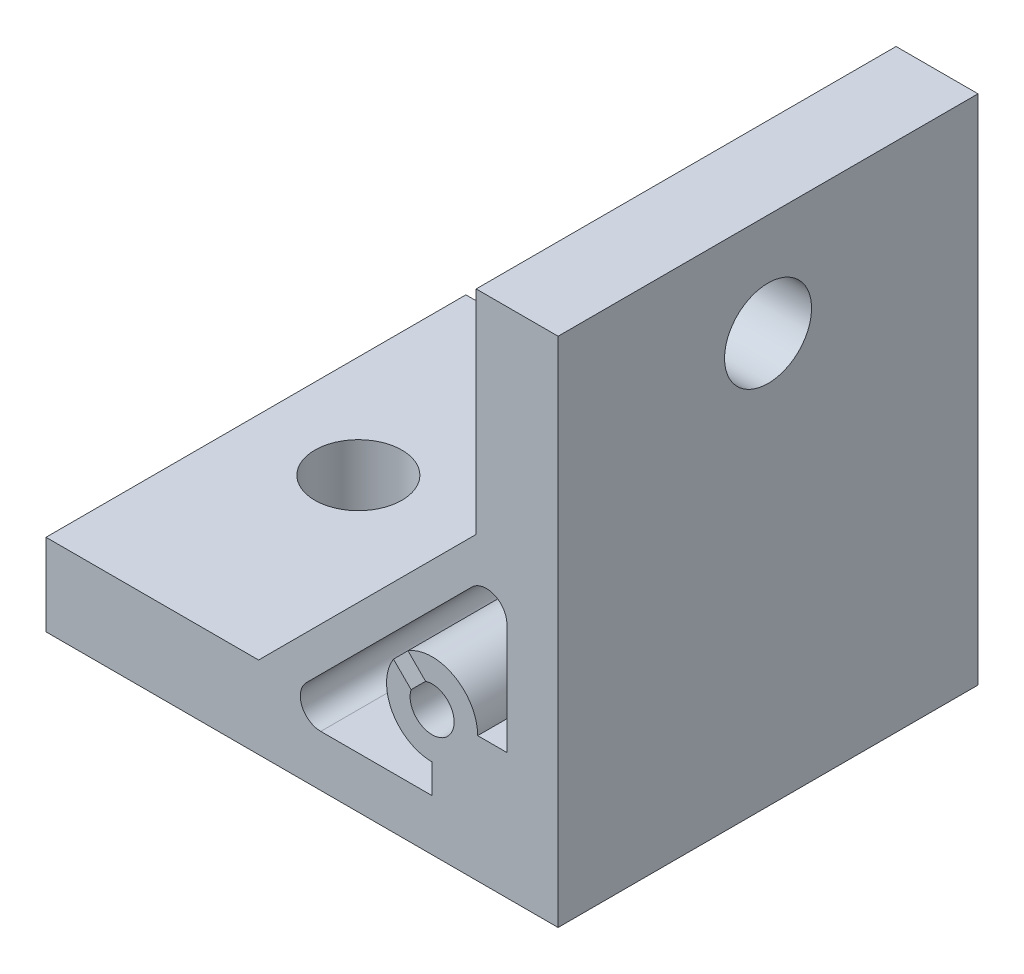
ISO-10303-21;
HEADER;
FILE_DESCRIPTION(('STEP AP214'),'2;1');
FILE_NAME('part.step','',(''),(''),'','','');
FILE_SCHEMA(('AUTOMOTIVE_DESIGN { 1 0 10303 214 1 1 1 1 }'));
ENDSEC;
DATA;
#1=APPLICATION_CONTEXT('core data for automotive mechanical design processes');
#2=APPLICATION_PROTOCOL_DEFINITION('international standard','automotive_design',2000,#1);
#3=PRODUCT_CONTEXT('',#1,'mechanical');
#4=PRODUCT('Part','Part','',(#3));
#5=PRODUCT_RELATED_PRODUCT_CATEGORY('part','',(#4));
#6=PRODUCT_DEFINITION_FORMATION('','',#4);
#7=PRODUCT_DEFINITION_CONTEXT('part definition',#1,'design');
#8=PRODUCT_DEFINITION('design','',#6,#7);
#9=PRODUCT_DEFINITION_SHAPE('','',#8);
#10=(LENGTH_UNIT() NAMED_UNIT(*) SI_UNIT(.MILLI.,.METRE.));
#11=(NAMED_UNIT(*) PLANE_ANGLE_UNIT() SI_UNIT($,.RADIAN.));
#12=(NAMED_UNIT(*) SI_UNIT($,.STERADIAN.) SOLID_ANGLE_UNIT());
#13=UNCERTAINTY_MEASURE_WITH_UNIT(LENGTH_MEASURE(1.E-05),#10,'distance_accuracy_value','');
#14=(GEOMETRIC_REPRESENTATION_CONTEXT(3) GLOBAL_UNCERTAINTY_ASSIGNED_CONTEXT((#13)) GLOBAL_UNIT_ASSIGNED_CONTEXT((#10,
#11,#12)) REPRESENTATION_CONTEXT('',''));
#15=CARTESIAN_POINT('',(0.,0.,0.));
#16=DIRECTION('',(0.,0.,1.));
#17=DIRECTION('',(1.,0.,0.));
#18=AXIS2_PLACEMENT_3D('',#15,#16,#17);
#19=CARTESIAN_POINT('',(50.,0.,20.5));
#20=DIRECTION('',(-1.,0.,0.));
#21=DIRECTION('',(0.,0.,1.));
#22=AXIS2_PLACEMENT_3D('',#19,#20,#21);
#23=PLANE('',#22);
#24=DIRECTION('',(0.,1.,0.));
#25=VECTOR('',#24,1.);
#26=CARTESIAN_POINT('',(50.,0.,-20.5));
#27=LINE('',#26,#25);
#28=CARTESIAN_POINT('',(50.,0.,-20.5));
#29=VERTEX_POINT('',#28);
#30=CARTESIAN_POINT('',(50.,50.,-20.5));
#31=VERTEX_POINT('',#30);
#32=EDGE_CURVE('E283',#29,#31,#27,.T.);
#33=ORIENTED_EDGE('',*,*,#32,.T.);
#34=DIRECTION('',(0.,0.,-1.));
#35=VECTOR('',#34,1.);
#36=CARTESIAN_POINT('',(50.,50.,20.5));
#37=LINE('',#36,#35);
#38=CARTESIAN_POINT('',(50.,50.,20.5));
#39=VERTEX_POINT('',#38);
#40=EDGE_CURVE('E303',#39,#31,#37,.T.);
#41=ORIENTED_EDGE('',*,*,#40,.F.);
#42=DIRECTION('',(0.,1.,0.));
#43=VECTOR('',#42,1.);
#44=CARTESIAN_POINT('',(50.,0.,20.5));
#45=LINE('',#44,#43);
#46=CARTESIAN_POINT('',(50.,0.,20.5));
#47=VERTEX_POINT('',#46);
#48=EDGE_CURVE('E268',#47,#39,#45,.T.);
#49=ORIENTED_EDGE('',*,*,#48,.F.);
#50=DIRECTION('',(0.,0.,-1.));
#51=VECTOR('',#50,1.);
#52=CARTESIAN_POINT('',(50.,0.,20.5));
#53=LINE('',#52,#51);
#54=EDGE_CURVE('E43',#47,#29,#53,.T.);
#55=ORIENTED_EDGE('',*,*,#54,.T.);
#56=EDGE_LOOP('',(#33,#41,#49,#55));
#57=FACE_BOUND('',#56,.T.);
#58=CARTESIAN_POINT('',(50.0000000000001,40.,0.));
#59=DIRECTION('',(1.,0.,0.));
#60=DIRECTION('',(0.,0.,1.));
#61=AXIS2_PLACEMENT_3D('',#58,#59,#60);
#62=CIRCLE('',#61,4.25);
#63=CARTESIAN_POINT('',(50.0000000000001,40.,4.25));
#64=VERTEX_POINT('',#63);
#65=EDGE_CURVE('E369',#64,#64,#62,.T.);
#66=ORIENTED_EDGE('',*,*,#65,.F.);
#67=EDGE_LOOP('',(#66));
#68=FACE_BOUND('',#67,.T.);
#69=ADVANCED_FACE('F35',(#57,#68),#23,.F.);
#70=CARTESIAN_POINT('',(42.,29.2426406871192,20.5));
#71=DIRECTION('',(1.,0.,0.));
#72=DIRECTION('',(0.,0.,-1.));
#73=AXIS2_PLACEMENT_3D('',#70,#71,#72);
#74=PLANE('',#73);
#75=DIRECTION('',(0.,-1.,0.));
#76=VECTOR('',#75,1.);
#77=CARTESIAN_POINT('',(42.,29.2426406871192,-20.5));
#78=LINE('',#77,#76);
#79=CARTESIAN_POINT('',(42.,50.,-20.5));
#80=VERTEX_POINT('',#79);
#81=CARTESIAN_POINT('',(42.,29.2426406871192,-20.5));
#82=VERTEX_POINT('',#81);
#83=EDGE_CURVE('E287',#80,#82,#78,.T.);
#84=ORIENTED_EDGE('',*,*,#83,.T.);
#85=DIRECTION('',(0.,0.,-1.));
#86=VECTOR('',#85,1.);
#87=CARTESIAN_POINT('',(42.,29.2426406871192,20.5));
#88=LINE('',#87,#86);
#89=CARTESIAN_POINT('',(42.,29.2426406871192,20.5));
#90=VERTEX_POINT('',#89);
#91=EDGE_CURVE('E297',#90,#82,#88,.T.);
#92=ORIENTED_EDGE('',*,*,#91,.F.);
#93=DIRECTION('',(0.,-1.,0.));
#94=VECTOR('',#93,1.);
#95=CARTESIAN_POINT('',(42.,29.2426406871192,20.5));
#96=LINE('',#95,#94);
#97=CARTESIAN_POINT('',(42.,50.,20.5));
#98=VERTEX_POINT('',#97);
#99=EDGE_CURVE('E272',#98,#90,#96,.T.);
#100=ORIENTED_EDGE('',*,*,#99,.F.);
#101=DIRECTION('',(0.,0.,-1.));
#102=VECTOR('',#101,1.);
#103=CARTESIAN_POINT('',(42.,50.,20.5));
#104=LINE('',#103,#102);
#105=EDGE_CURVE('E300',#98,#80,#104,.T.);
#106=ORIENTED_EDGE('',*,*,#105,.T.);
#107=EDGE_LOOP('',(#84,#92,#100,#106));
#108=FACE_BOUND('',#107,.T.);
#109=CARTESIAN_POINT('',(42.0000000000001,40.0000000000001,0.));
#110=DIRECTION('',(1.,0.,0.));
#111=DIRECTION('',(0.,0.,1.));
#112=AXIS2_PLACEMENT_3D('',#109,#110,#111);
#113=CIRCLE('',#112,4.25);
#114=CARTESIAN_POINT('',(42.0000000000001,40.0000000000001,4.25));
#115=VERTEX_POINT('',#114);
#116=EDGE_CURVE('E371',#115,#115,#113,.T.);
#117=ORIENTED_EDGE('',*,*,#116,.T.);
#118=EDGE_LOOP('',(#117));
#119=FACE_BOUND('',#118,.T.);
#120=ADVANCED_FACE('F326',(#108,#119),#74,.F.);
#121=CARTESIAN_POINT('',(0.,0.,20.5));
#122=DIRECTION('',(0.,0.,1.));
#123=DIRECTION('',(1.,0.,0.));
#124=AXIS2_PLACEMENT_3D('',#121,#122,#123);
#125=PLANE('',#124);
#126=DIRECTION('',(0.,-1.,0.));
#127=VECTOR('',#126,1.);
#128=CARTESIAN_POINT('',(0.,8.,20.5));
#129=LINE('',#128,#127);
#130=CARTESIAN_POINT('',(0.,8.,20.5));
#131=VERTEX_POINT('',#130);
#132=CARTESIAN_POINT('',(0.,0.,20.5));
#133=VERTEX_POINT('',#132);
#134=EDGE_CURVE('E262',#131,#133,#129,.T.);
#135=ORIENTED_EDGE('',*,*,#134,.T.);
#136=DIRECTION('',(1.,0.,0.));
#137=VECTOR('',#136,1.);
#138=CARTESIAN_POINT('',(0.,0.,20.5));
#139=LINE('',#138,#137);
#140=EDGE_CURVE('E265',#133,#47,#139,.T.);
#141=ORIENTED_EDGE('',*,*,#140,.T.);
#142=ORIENTED_EDGE('',*,*,#48,.T.);
#143=DIRECTION('',(-1.,0.,0.));
#144=VECTOR('',#143,1.);
#145=CARTESIAN_POINT('',(42.,50.,20.5));
#146=LINE('',#145,#144);
#147=EDGE_CURVE('E270',#39,#98,#146,.T.);
#148=ORIENTED_EDGE('',*,*,#147,.T.);
#149=ORIENTED_EDGE('',*,*,#99,.T.);
#150=DIRECTION('',(-0.707106781186546,-0.707106781186549,0.));
#151=VECTOR('',#150,1.);
#152=CARTESIAN_POINT('',(20.7573593128809,8.,20.5));
#153=LINE('',#152,#151);
#154=CARTESIAN_POINT('',(20.7573593128809,8.,20.5));
#155=VERTEX_POINT('',#154);
#156=EDGE_CURVE('E274',#90,#155,#153,.T.);
#157=ORIENTED_EDGE('',*,*,#156,.T.);
#158=DIRECTION('',(-1.,0.,0.));
#159=VECTOR('',#158,1.);
#160=CARTESIAN_POINT('',(0.,8.,20.5));
#161=LINE('',#160,#159);
#162=EDGE_CURVE('E276',#155,#131,#161,.T.);
#163=ORIENTED_EDGE('',*,*,#162,.T.);
#164=EDGE_LOOP('',(#135,#141,#142,#148,#149,#157,#163));
#165=FACE_BOUND('',#164,.T.);
#166=DIRECTION('',(0.707106781186549,-0.707106781186546,0.));
#167=VECTOR('',#166,1.);
#168=CARTESIAN_POINT('',(35.647066335444,12.9387201021829,20.5));
#169=LINE('',#168,#167);
#170=CARTESIAN_POINT('',(33.9267474297161,14.6590390079109,20.5));
#171=VERTEX_POINT('',#170);
#172=CARTESIAN_POINT('',(35.647066335444,12.9387201021829,20.5));
#173=VERTEX_POINT('',#172);
#174=EDGE_CURVE('E174',#171,#173,#169,.T.);
#175=ORIENTED_EDGE('',*,*,#174,.F.);
#176=CARTESIAN_POINT('',(37.7,12.3,20.5));
#177=DIRECTION('',(0.,0.,-1.));
#178=DIRECTION('',(1.,0.,0.));
#179=AXIS2_PLACEMENT_3D('',#176,#177,#178);
#180=CIRCLE('',#179,4.45);
#181=CARTESIAN_POINT('',(37.7,7.84999999999995,20.5));
#182=VERTEX_POINT('',#181);
#183=EDGE_CURVE('E166',#182,#171,#180,.T.);
#184=ORIENTED_EDGE('',*,*,#183,.F.);
#185=DIRECTION('',(0.,1.,0.));
#186=VECTOR('',#185,1.);
#187=CARTESIAN_POINT('',(37.7,5.,20.5));
#188=LINE('',#187,#186);
#189=CARTESIAN_POINT('',(37.7,5.,20.5));
#190=VERTEX_POINT('',#189);
#191=EDGE_CURVE('E209',#190,#182,#188,.T.);
#192=ORIENTED_EDGE('',*,*,#191,.F.);
#193=DIRECTION('',(1.,0.,0.));
#194=VECTOR('',#193,1.);
#195=CARTESIAN_POINT('',(26.828427124746,5.,20.5));
#196=LINE('',#195,#194);
#197=CARTESIAN_POINT('',(26.828427124746,4.99999999999993,20.5));
#198=VERTEX_POINT('',#197);
#199=EDGE_CURVE('E207',#198,#190,#196,.T.);
#200=ORIENTED_EDGE('',*,*,#199,.F.);
#201=CARTESIAN_POINT('',(26.8284271247464,7.00000000000011,20.5));
#202=DIRECTION('',(0.,0.,1.));
#203=DIRECTION('',(1.,0.,0.));
#204=AXIS2_PLACEMENT_3D('',#201,#202,#203);
#205=CIRCLE('',#204,2.00000000000019);
#206=CARTESIAN_POINT('',(25.4142135623729,8.41421356237311,20.5));
#207=VERTEX_POINT('',#206);
#208=EDGE_CURVE('E205',#207,#198,#205,.T.);
#209=ORIENTED_EDGE('',*,*,#208,.F.);
#210=DIRECTION('',(-0.70710678118655,-0.707106781186545,0.));
#211=VECTOR('',#210,1.);
#212=CARTESIAN_POINT('',(25.4142135623729,8.41421356237311,20.5));
#213=LINE('',#212,#211);
#214=CARTESIAN_POINT('',(41.585786437627,24.5857864376269,20.5));
#215=VERTEX_POINT('',#214);
#216=EDGE_CURVE('E203',#215,#207,#213,.T.);
#217=ORIENTED_EDGE('',*,*,#216,.F.);
#218=CARTESIAN_POINT('',(43.0000000000002,23.171572875254,20.5));
#219=DIRECTION('',(0.,0.,1.));
#220=DIRECTION('',(1.,0.,0.));
#221=AXIS2_PLACEMENT_3D('',#218,#219,#220);
#222=CIRCLE('',#221,1.99999999999993);
#223=CARTESIAN_POINT('',(45.,23.1715728752539,20.5));
#224=VERTEX_POINT('',#223);
#225=EDGE_CURVE('E201',#224,#215,#222,.T.);
#226=ORIENTED_EDGE('',*,*,#225,.F.);
#227=DIRECTION('',(0.,1.,0.));
#228=VECTOR('',#227,1.);
#229=CARTESIAN_POINT('',(45.,23.1715728752539,20.5));
#230=LINE('',#229,#228);
#231=CARTESIAN_POINT('',(45.,12.3,20.5));
#232=VERTEX_POINT('',#231);
#233=EDGE_CURVE('E199',#232,#224,#230,.T.);
#234=ORIENTED_EDGE('',*,*,#233,.F.);
#235=DIRECTION('',(1.,0.,0.));
#236=VECTOR('',#235,1.);
#237=CARTESIAN_POINT('',(42.15,12.3,20.5));
#238=LINE('',#237,#236);
#239=CARTESIAN_POINT('',(42.15,12.3,20.5));
#240=VERTEX_POINT('',#239);
#241=EDGE_CURVE('E197',#240,#232,#238,.T.);
#242=ORIENTED_EDGE('',*,*,#241,.F.);
#243=CARTESIAN_POINT('',(37.7,12.3,20.5));
#244=DIRECTION('',(0.,0.,-1.));
#245=DIRECTION('',(1.,0.,0.));
#246=AXIS2_PLACEMENT_3D('',#243,#244,#245);
#247=CIRCLE('',#246,4.45);
#248=CARTESIAN_POINT('',(35.3409609920885,16.0732525702836,20.5));
#249=VERTEX_POINT('',#248);
#250=EDGE_CURVE('E195',#249,#240,#247,.T.);
#251=ORIENTED_EDGE('',*,*,#250,.F.);
#252=DIRECTION('',(-0.707106781186684,0.707106781186411,0.));
#253=VECTOR('',#252,1.);
#254=CARTESIAN_POINT('',(37.0612798978168,14.3529336645559,20.5));
#255=LINE('',#254,#253);
#256=CARTESIAN_POINT('',(37.0612798978168,14.3529336645559,20.5));
#257=VERTEX_POINT('',#256);
#258=EDGE_CURVE('E190',#257,#249,#255,.T.);
#259=ORIENTED_EDGE('',*,*,#258,.F.);
#260=CARTESIAN_POINT('',(37.7,12.3,20.5));
#261=DIRECTION('',(0.,0.,1.));
#262=DIRECTION('',(1.,0.,0.));
#263=AXIS2_PLACEMENT_3D('',#260,#261,#262);
#264=CIRCLE('',#263,2.15);
#265=EDGE_CURVE('E188',#173,#257,#264,.T.);
#266=ORIENTED_EDGE('',*,*,#265,.F.);
#267=EDGE_LOOP('',(#175,#184,#192,#200,#209,#217,#226,#234,#242,#251,#259,#266));
#268=FACE_BOUND('',#267,.T.);
#269=ADVANCED_FACE('F186',(#165,#268),#125,.T.);
#270=CARTESIAN_POINT('',(0.,0.,-20.5));
#271=DIRECTION('',(0.,0.,1.));
#272=DIRECTION('',(1.,0.,0.));
#273=AXIS2_PLACEMENT_3D('',#270,#271,#272);
#274=PLANE('',#273);
#275=DIRECTION('',(0.,-1.,0.));
#276=VECTOR('',#275,1.);
#277=CARTESIAN_POINT('',(0.,8.,-20.5));
#278=LINE('',#277,#276);
#279=CARTESIAN_POINT('',(0.,8.,-20.5));
#280=VERTEX_POINT('',#279);
#281=CARTESIAN_POINT('',(0.,0.,-20.5));
#282=VERTEX_POINT('',#281);
#283=EDGE_CURVE('E182',#280,#282,#278,.T.);
#284=ORIENTED_EDGE('',*,*,#283,.F.);
#285=DIRECTION('',(-1.,0.,0.));
#286=VECTOR('',#285,1.);
#287=CARTESIAN_POINT('',(0.,8.,-20.5));
#288=LINE('',#287,#286);
#289=CARTESIAN_POINT('',(20.7573593128809,8.,-20.5));
#290=VERTEX_POINT('',#289);
#291=EDGE_CURVE('E266',#290,#280,#288,.T.);
#292=ORIENTED_EDGE('',*,*,#291,.F.);
#293=DIRECTION('',(-0.707106781186546,-0.707106781186549,0.));
#294=VECTOR('',#293,1.);
#295=CARTESIAN_POINT('',(20.7573593128809,8.,-20.5));
#296=LINE('',#295,#294);
#297=EDGE_CURVE('E289',#82,#290,#296,.T.);
#298=ORIENTED_EDGE('',*,*,#297,.F.);
#299=ORIENTED_EDGE('',*,*,#83,.F.);
#300=DIRECTION('',(-1.,0.,0.));
#301=VECTOR('',#300,1.);
#302=CARTESIAN_POINT('',(42.,50.,-20.5));
#303=LINE('',#302,#301);
#304=EDGE_CURVE('E285',#31,#80,#303,.T.);
#305=ORIENTED_EDGE('',*,*,#304,.F.);
#306=ORIENTED_EDGE('',*,*,#32,.F.);
#307=DIRECTION('',(1.,0.,0.));
#308=VECTOR('',#307,1.);
#309=CARTESIAN_POINT('',(0.,0.,-20.5));
#310=LINE('',#309,#308);
#311=EDGE_CURVE('E281',#282,#29,#310,.T.);
#312=ORIENTED_EDGE('',*,*,#311,.F.);
#313=EDGE_LOOP('',(#284,#292,#298,#299,#305,#306,#312));
#314=FACE_BOUND('',#313,.T.);
#315=CARTESIAN_POINT('',(37.7,12.3,-20.5));
#316=DIRECTION('',(0.,0.,-1.));
#317=DIRECTION('',(1.,0.,0.));
#318=AXIS2_PLACEMENT_3D('',#315,#316,#317);
#319=CIRCLE('',#318,4.45);
#320=CARTESIAN_POINT('',(37.7,7.84999999999995,-20.5));
#321=VERTEX_POINT('',#320);
#322=CARTESIAN_POINT('',(33.9267474297161,14.6590390079109,-20.5));
#323=VERTEX_POINT('',#322);
#324=EDGE_CURVE('E58',#321,#323,#319,.T.);
#325=ORIENTED_EDGE('',*,*,#324,.T.);
#326=DIRECTION('',(0.707106781186549,-0.707106781186546,0.));
#327=VECTOR('',#326,1.);
#328=CARTESIAN_POINT('',(35.647066335444,12.9387201021829,-20.5));
#329=LINE('',#328,#327);
#330=CARTESIAN_POINT('',(35.647066335444,12.9387201021829,-20.5));
#331=VERTEX_POINT('',#330);
#332=EDGE_CURVE('E181',#323,#331,#329,.T.);
#333=ORIENTED_EDGE('',*,*,#332,.T.);
#334=CARTESIAN_POINT('',(37.7,12.3,-20.5));
#335=DIRECTION('',(0.,0.,1.));
#336=DIRECTION('',(1.,0.,0.));
#337=AXIS2_PLACEMENT_3D('',#334,#335,#336);
#338=CIRCLE('',#337,2.15);
#339=CARTESIAN_POINT('',(37.0612798978168,14.3529336645559,-20.5));
#340=VERTEX_POINT('',#339);
#341=EDGE_CURVE('E214',#331,#340,#338,.T.);
#342=ORIENTED_EDGE('',*,*,#341,.T.);
#343=DIRECTION('',(-0.707106781186684,0.707106781186411,0.));
#344=VECTOR('',#343,1.);
#345=CARTESIAN_POINT('',(37.0612798978168,14.3529336645559,-20.5));
#346=LINE('',#345,#344);
#347=CARTESIAN_POINT('',(35.3409609920885,16.0732525702836,-20.5));
#348=VERTEX_POINT('',#347);
#349=EDGE_CURVE('E217',#340,#348,#346,.T.);
#350=ORIENTED_EDGE('',*,*,#349,.T.);
#351=CARTESIAN_POINT('',(37.7,12.3,-20.5));
#352=DIRECTION('',(0.,0.,-1.));
#353=DIRECTION('',(1.,0.,0.));
#354=AXIS2_PLACEMENT_3D('',#351,#352,#353);
#355=CIRCLE('',#354,4.45);
#356=CARTESIAN_POINT('',(42.15,12.3,-20.5));
#357=VERTEX_POINT('',#356);
#358=EDGE_CURVE('E220',#348,#357,#355,.T.);
#359=ORIENTED_EDGE('',*,*,#358,.T.);
#360=DIRECTION('',(1.,0.,0.));
#361=VECTOR('',#360,1.);
#362=CARTESIAN_POINT('',(42.15,12.3,-20.5));
#363=LINE('',#362,#361);
#364=CARTESIAN_POINT('',(45.,12.3,-20.5));
#365=VERTEX_POINT('',#364);
#366=EDGE_CURVE('E223',#357,#365,#363,.T.);
#367=ORIENTED_EDGE('',*,*,#366,.T.);
#368=DIRECTION('',(0.,1.,0.));
#369=VECTOR('',#368,1.);
#370=CARTESIAN_POINT('',(45.,23.1715728752539,-20.5));
#371=LINE('',#370,#369);
#372=CARTESIAN_POINT('',(45.,23.1715728752539,-20.5));
#373=VERTEX_POINT('',#372);
#374=EDGE_CURVE('E226',#365,#373,#371,.T.);
#375=ORIENTED_EDGE('',*,*,#374,.T.);
#376=CARTESIAN_POINT('',(43.0000000000002,23.171572875254,-20.5));
#377=DIRECTION('',(0.,0.,1.));
#378=DIRECTION('',(1.,0.,0.));
#379=AXIS2_PLACEMENT_3D('',#376,#377,#378);
#380=CIRCLE('',#379,1.99999999999993);
#381=CARTESIAN_POINT('',(41.585786437627,24.5857864376269,-20.5));
#382=VERTEX_POINT('',#381);
#383=EDGE_CURVE('E229',#373,#382,#380,.T.);
#384=ORIENTED_EDGE('',*,*,#383,.T.);
#385=DIRECTION('',(-0.70710678118655,-0.707106781186545,0.));
#386=VECTOR('',#385,1.);
#387=CARTESIAN_POINT('',(25.4142135623729,8.41421356237311,-20.5));
#388=LINE('',#387,#386);
#389=CARTESIAN_POINT('',(25.4142135623729,8.41421356237311,-20.5));
#390=VERTEX_POINT('',#389);
#391=EDGE_CURVE('E232',#382,#390,#388,.T.);
#392=ORIENTED_EDGE('',*,*,#391,.T.);
#393=CARTESIAN_POINT('',(26.8284271247464,7.00000000000011,-20.5));
#394=DIRECTION('',(0.,0.,1.));
#395=DIRECTION('',(1.,0.,0.));
#396=AXIS2_PLACEMENT_3D('',#393,#394,#395);
#397=CIRCLE('',#396,2.00000000000019);
#398=CARTESIAN_POINT('',(26.828427124746,4.99999999999993,-20.5));
#399=VERTEX_POINT('',#398);
#400=EDGE_CURVE('E235',#390,#399,#397,.T.);
#401=ORIENTED_EDGE('',*,*,#400,.T.);
#402=DIRECTION('',(1.,0.,0.));
#403=VECTOR('',#402,1.);
#404=CARTESIAN_POINT('',(26.828427124746,5.,-20.5));
#405=LINE('',#404,#403);
#406=CARTESIAN_POINT('',(37.7,5.,-20.5));
#407=VERTEX_POINT('',#406);
#408=EDGE_CURVE('E238',#399,#407,#405,.T.);
#409=ORIENTED_EDGE('',*,*,#408,.T.);
#410=DIRECTION('',(0.,1.,0.));
#411=VECTOR('',#410,1.);
#412=CARTESIAN_POINT('',(37.7,5.,-20.5));
#413=LINE('',#412,#411);
#414=EDGE_CURVE('E175',#407,#321,#413,.T.);
#415=ORIENTED_EDGE('',*,*,#414,.T.);
#416=EDGE_LOOP('',(#325,#333,#342,#350,#359,#367,#375,#384,#392,#401,#409,#415));
#417=FACE_BOUND('',#416,.T.);
#418=ADVANCED_FACE('F316',(#314,#417),#274,.F.);
#419=CARTESIAN_POINT('',(0.,8.,20.5));
#420=DIRECTION('',(1.,0.,0.));
#421=DIRECTION('',(0.,0.,-1.));
#422=AXIS2_PLACEMENT_3D('',#419,#420,#421);
#423=PLANE('',#422);
#424=ORIENTED_EDGE('',*,*,#283,.T.);
#425=DIRECTION('',(0.,0.,-1.));
#426=VECTOR('',#425,1.);
#427=CARTESIAN_POINT('',(0.,0.,20.5));
#428=LINE('',#427,#426);
#429=EDGE_CURVE('E11',#133,#282,#428,.T.);
#430=ORIENTED_EDGE('',*,*,#429,.F.);
#431=ORIENTED_EDGE('',*,*,#134,.F.);
#432=DIRECTION('',(0.,0.,-1.));
#433=VECTOR('',#432,1.);
#434=CARTESIAN_POINT('',(0.,8.,20.5));
#435=LINE('',#434,#433);
#436=EDGE_CURVE('E278',#131,#280,#435,.T.);
#437=ORIENTED_EDGE('',*,*,#436,.T.);
#438=EDGE_LOOP('',(#424,#430,#431,#437));
#439=FACE_BOUND('',#438,.T.);
#440=ADVANCED_FACE('F37',(#439),#423,.F.);
#441=CARTESIAN_POINT('',(0.,0.,20.5));
#442=DIRECTION('',(0.,1.,0.));
#443=DIRECTION('',(0.,0.,1.));
#444=AXIS2_PLACEMENT_3D('',#441,#442,#443);
#445=PLANE('',#444);
#446=CARTESIAN_POINT('',(10.,0.,0.));
#447=DIRECTION('',(0.,1.,0.));
#448=DIRECTION('',(0.,0.,1.));
#449=AXIS2_PLACEMENT_3D('',#446,#447,#448);
#450=CIRCLE('',#449,4.25);
#451=CARTESIAN_POINT('',(10.,0.,4.25));
#452=VERTEX_POINT('',#451);
#453=EDGE_CURVE('E212',#452,#452,#450,.T.);
#454=ORIENTED_EDGE('',*,*,#453,.T.);
#455=EDGE_LOOP('',(#454));
#456=FACE_BOUND('',#455,.T.);
#457=ORIENTED_EDGE('',*,*,#311,.T.);
#458=ORIENTED_EDGE('',*,*,#54,.F.);
#459=ORIENTED_EDGE('',*,*,#140,.F.);
#460=ORIENTED_EDGE('',*,*,#429,.T.);
#461=EDGE_LOOP('',(#457,#458,#459,#460));
#462=FACE_BOUND('',#461,.T.);
#463=ADVANCED_FACE('F334',(#456,#462),#445,.F.);
#464=CARTESIAN_POINT('',(42.,50.,20.5));
#465=DIRECTION('',(0.,-1.,0.));
#466=DIRECTION('',(0.,0.,-1.));
#467=AXIS2_PLACEMENT_3D('',#464,#465,#466);
#468=PLANE('',#467);
#469=ORIENTED_EDGE('',*,*,#304,.T.);
#470=ORIENTED_EDGE('',*,*,#105,.F.);
#471=ORIENTED_EDGE('',*,*,#147,.F.);
#472=ORIENTED_EDGE('',*,*,#40,.T.);
#473=EDGE_LOOP('',(#469,#470,#471,#472));
#474=FACE_BOUND('',#473,.T.);
#475=ADVANCED_FACE('F322',(#474),#468,.F.);
#476=CARTESIAN_POINT('',(20.7573593128809,8.,20.5));
#477=DIRECTION('',(0.707106781186549,-0.707106781186546,0.));
#478=DIRECTION('',(0.707106781186546,0.707106781186549,0.));
#479=AXIS2_PLACEMENT_3D('',#476,#477,#478);
#480=PLANE('',#479);
#481=ORIENTED_EDGE('',*,*,#297,.T.);
#482=DIRECTION('',(0.,0.,-1.));
#483=VECTOR('',#482,1.);
#484=CARTESIAN_POINT('',(20.7573593128809,8.,20.5));
#485=LINE('',#484,#483);
#486=EDGE_CURVE('E294',#155,#290,#485,.T.);
#487=ORIENTED_EDGE('',*,*,#486,.F.);
#488=ORIENTED_EDGE('',*,*,#156,.F.);
#489=ORIENTED_EDGE('',*,*,#91,.T.);
#490=EDGE_LOOP('',(#481,#487,#488,#489));
#491=FACE_BOUND('',#490,.T.);
#492=ADVANCED_FACE('F342',(#491),#480,.F.);
#493=CARTESIAN_POINT('',(0.,8.,20.5));
#494=DIRECTION('',(0.,-1.,0.));
#495=DIRECTION('',(0.,0.,-1.));
#496=AXIS2_PLACEMENT_3D('',#493,#494,#495);
#497=PLANE('',#496);
#498=CARTESIAN_POINT('',(10.,8.,0.));
#499=DIRECTION('',(0.,1.,0.));
#500=DIRECTION('',(0.,0.,1.));
#501=AXIS2_PLACEMENT_3D('',#498,#499,#500);
#502=CIRCLE('',#501,4.25);
#503=CARTESIAN_POINT('',(10.,8.,4.25));
#504=VERTEX_POINT('',#503);
#505=EDGE_CURVE('E366',#504,#504,#502,.T.);
#506=ORIENTED_EDGE('',*,*,#505,.F.);
#507=EDGE_LOOP('',(#506));
#508=FACE_BOUND('',#507,.T.);
#509=ORIENTED_EDGE('',*,*,#291,.T.);
#510=ORIENTED_EDGE('',*,*,#436,.F.);
#511=ORIENTED_EDGE('',*,*,#162,.F.);
#512=ORIENTED_EDGE('',*,*,#486,.T.);
#513=EDGE_LOOP('',(#509,#510,#511,#512));
#514=FACE_BOUND('',#513,.T.);
#515=ADVANCED_FACE('F339',(#508,#514),#497,.F.);
#516=CARTESIAN_POINT('',(37.7,12.3,20.5));
#517=DIRECTION('',(0.,0.,-1.));
#518=DIRECTION('',(-1.,0.,0.));
#519=AXIS2_PLACEMENT_3D('',#516,#517,#518);
#520=CYLINDRICAL_SURFACE('',#519,4.45);
#521=ORIENTED_EDGE('',*,*,#324,.F.);
#522=DIRECTION('',(0.,0.,-1.));
#523=VECTOR('',#522,1.);
#524=CARTESIAN_POINT('',(37.7,7.84999999999995,20.5));
#525=LINE('',#524,#523);
#526=EDGE_CURVE('E170',#182,#321,#525,.T.);
#527=ORIENTED_EDGE('',*,*,#526,.F.);
#528=ORIENTED_EDGE('',*,*,#183,.T.);
#529=DIRECTION('',(0.,0.,-1.));
#530=VECTOR('',#529,1.);
#531=CARTESIAN_POINT('',(33.9267474297161,14.6590390079109,20.5));
#532=LINE('',#531,#530);
#533=EDGE_CURVE('E169',#171,#323,#532,.T.);
#534=ORIENTED_EDGE('',*,*,#533,.T.);
#535=EDGE_LOOP('',(#521,#527,#528,#534));
#536=FACE_BOUND('',#535,.T.);
#537=ADVANCED_FACE('F168',(#536),#520,.T.);
#538=CARTESIAN_POINT('',(35.647066335444,12.9387201021829,20.5));
#539=DIRECTION('',(0.707106781186546,0.707106781186549,0.));
#540=DIRECTION('',(-0.707106781186549,0.707106781186546,0.));
#541=AXIS2_PLACEMENT_3D('',#538,#539,#540);
#542=PLANE('',#541);
#543=ORIENTED_EDGE('',*,*,#332,.F.);
#544=ORIENTED_EDGE('',*,*,#533,.F.);
#545=ORIENTED_EDGE('',*,*,#174,.T.);
#546=DIRECTION('',(0.,0.,-1.));
#547=VECTOR('',#546,1.);
#548=CARTESIAN_POINT('',(35.647066335444,12.9387201021829,20.5));
#549=LINE('',#548,#547);
#550=EDGE_CURVE('E183',#173,#331,#549,.T.);
#551=ORIENTED_EDGE('',*,*,#550,.T.);
#552=EDGE_LOOP('',(#543,#544,#545,#551));
#553=FACE_BOUND('',#552,.T.);
#554=ADVANCED_FACE('F178',(#553),#542,.T.);
#555=CARTESIAN_POINT('',(37.7,12.3,20.5));
#556=DIRECTION('',(0.,0.,-1.));
#557=DIRECTION('',(-1.,0.,0.));
#558=AXIS2_PLACEMENT_3D('',#555,#556,#557);
#559=CYLINDRICAL_SURFACE('',#558,2.15);
#560=ORIENTED_EDGE('',*,*,#341,.F.);
#561=ORIENTED_EDGE('',*,*,#550,.F.);
#562=ORIENTED_EDGE('',*,*,#265,.T.);
#563=DIRECTION('',(0.,0.,-1.));
#564=VECTOR('',#563,1.);
#565=CARTESIAN_POINT('',(37.0612798978168,14.3529336645559,20.5));
#566=LINE('',#565,#564);
#567=EDGE_CURVE('E259',#257,#340,#566,.T.);
#568=ORIENTED_EDGE('',*,*,#567,.T.);
#569=EDGE_LOOP('',(#560,#561,#562,#568));
#570=FACE_BOUND('',#569,.T.);
#571=ADVANCED_FACE('F422',(#570),#559,.F.);
#572=CARTESIAN_POINT('',(37.0612798978168,14.3529336645559,20.5));
#573=DIRECTION('',(-0.707106781186411,-0.707106781186684,0.));
#574=DIRECTION('',(0.707106781186684,-0.707106781186411,0.));
#575=AXIS2_PLACEMENT_3D('',#572,#573,#574);
#576=PLANE('',#575);
#577=ORIENTED_EDGE('',*,*,#349,.F.);
#578=ORIENTED_EDGE('',*,*,#567,.F.);
#579=ORIENTED_EDGE('',*,*,#258,.T.);
#580=DIRECTION('',(0.,0.,-1.));
#581=VECTOR('',#580,1.);
#582=CARTESIAN_POINT('',(35.3409609920885,16.0732525702836,20.5));
#583=LINE('',#582,#581);
#584=EDGE_CURVE('E257',#249,#348,#583,.T.);
#585=ORIENTED_EDGE('',*,*,#584,.T.);
#586=EDGE_LOOP('',(#577,#578,#579,#585));
#587=FACE_BOUND('',#586,.T.);
#588=ADVANCED_FACE('F418',(#587),#576,.T.);
#589=CARTESIAN_POINT('',(37.7,12.3,20.5));
#590=DIRECTION('',(0.,0.,-1.));
#591=DIRECTION('',(-1.,0.,0.));
#592=AXIS2_PLACEMENT_3D('',#589,#590,#591);
#593=CYLINDRICAL_SURFACE('',#592,4.45);
#594=ORIENTED_EDGE('',*,*,#358,.F.);
#595=ORIENTED_EDGE('',*,*,#584,.F.);
#596=ORIENTED_EDGE('',*,*,#250,.T.);
#597=DIRECTION('',(0.,0.,-1.));
#598=VECTOR('',#597,1.);
#599=CARTESIAN_POINT('',(42.15,12.3,20.5));
#600=LINE('',#599,#598);
#601=EDGE_CURVE('E255',#240,#357,#600,.T.);
#602=ORIENTED_EDGE('',*,*,#601,.T.);
#603=EDGE_LOOP('',(#594,#595,#596,#602));
#604=FACE_BOUND('',#603,.T.);
#605=ADVANCED_FACE('F414',(#604),#593,.T.);
#606=CARTESIAN_POINT('',(42.15,12.3,20.5));
#607=DIRECTION('',(0.,1.,0.));
#608=DIRECTION('',(0.,0.,1.));
#609=AXIS2_PLACEMENT_3D('',#606,#607,#608);
#610=PLANE('',#609);
#611=ORIENTED_EDGE('',*,*,#366,.F.);
#612=ORIENTED_EDGE('',*,*,#601,.F.);
#613=ORIENTED_EDGE('',*,*,#241,.T.);
#614=DIRECTION('',(0.,0.,-1.));
#615=VECTOR('',#614,1.);
#616=CARTESIAN_POINT('',(45.,12.3,20.5));
#617=LINE('',#616,#615);
#618=EDGE_CURVE('E253',#232,#365,#617,.T.);
#619=ORIENTED_EDGE('',*,*,#618,.T.);
#620=EDGE_LOOP('',(#611,#612,#613,#619));
#621=FACE_BOUND('',#620,.T.);
#622=ADVANCED_FACE('F410',(#621),#610,.T.);
#623=CARTESIAN_POINT('',(45.,23.1715728752539,20.5));
#624=DIRECTION('',(-1.,0.,0.));
#625=DIRECTION('',(0.,0.,1.));
#626=AXIS2_PLACEMENT_3D('',#623,#624,#625);
#627=PLANE('',#626);
#628=ORIENTED_EDGE('',*,*,#374,.F.);
#629=ORIENTED_EDGE('',*,*,#618,.F.);
#630=ORIENTED_EDGE('',*,*,#233,.T.);
#631=DIRECTION('',(0.,0.,-1.));
#632=VECTOR('',#631,1.);
#633=CARTESIAN_POINT('',(45.,23.1715728752539,20.5));
#634=LINE('',#633,#632);
#635=EDGE_CURVE('E251',#224,#373,#634,.T.);
#636=ORIENTED_EDGE('',*,*,#635,.T.);
#637=EDGE_LOOP('',(#628,#629,#630,#636));
#638=FACE_BOUND('',#637,.T.);
#639=ADVANCED_FACE('F406',(#638),#627,.T.);
#640=CARTESIAN_POINT('',(43.0000000000002,23.171572875254,20.5));
#641=DIRECTION('',(0.,0.,-1.));
#642=DIRECTION('',(-1.,0.,0.));
#643=AXIS2_PLACEMENT_3D('',#640,#641,#642);
#644=CYLINDRICAL_SURFACE('',#643,1.99999999999993);
#645=ORIENTED_EDGE('',*,*,#383,.F.);
#646=ORIENTED_EDGE('',*,*,#635,.F.);
#647=ORIENTED_EDGE('',*,*,#225,.T.);
#648=DIRECTION('',(0.,0.,-1.));
#649=VECTOR('',#648,1.);
#650=CARTESIAN_POINT('',(41.585786437627,24.5857864376269,20.5));
#651=LINE('',#650,#649);
#652=EDGE_CURVE('E249',#215,#382,#651,.T.);
#653=ORIENTED_EDGE('',*,*,#652,.T.);
#654=EDGE_LOOP('',(#645,#646,#647,#653));
#655=FACE_BOUND('',#654,.T.);
#656=ADVANCED_FACE('F402',(#655),#644,.F.);
#657=CARTESIAN_POINT('',(25.4142135623729,8.41421356237311,20.5));
#658=DIRECTION('',(0.707106781186545,-0.70710678118655,0.));
#659=DIRECTION('',(0.70710678118655,0.707106781186545,0.));
#660=AXIS2_PLACEMENT_3D('',#657,#658,#659);
#661=PLANE('',#660);
#662=ORIENTED_EDGE('',*,*,#391,.F.);
#663=ORIENTED_EDGE('',*,*,#652,.F.);
#664=ORIENTED_EDGE('',*,*,#216,.T.);
#665=DIRECTION('',(0.,0.,-1.));
#666=VECTOR('',#665,1.);
#667=CARTESIAN_POINT('',(25.4142135623729,8.41421356237311,20.5));
#668=LINE('',#667,#666);
#669=EDGE_CURVE('E247',#207,#390,#668,.T.);
#670=ORIENTED_EDGE('',*,*,#669,.T.);
#671=EDGE_LOOP('',(#662,#663,#664,#670));
#672=FACE_BOUND('',#671,.T.);
#673=ADVANCED_FACE('F398',(#672),#661,.T.);
#674=CARTESIAN_POINT('',(26.8284271247464,7.00000000000011,20.5));
#675=DIRECTION('',(0.,0.,-1.));
#676=DIRECTION('',(-1.,0.,0.));
#677=AXIS2_PLACEMENT_3D('',#674,#675,#676);
#678=CYLINDRICAL_SURFACE('',#677,2.00000000000019);
#679=ORIENTED_EDGE('',*,*,#400,.F.);
#680=ORIENTED_EDGE('',*,*,#669,.F.);
#681=ORIENTED_EDGE('',*,*,#208,.T.);
#682=DIRECTION('',(0.,0.,-1.));
#683=VECTOR('',#682,1.);
#684=CARTESIAN_POINT('',(26.828427124746,4.99999999999993,20.5));
#685=LINE('',#684,#683);
#686=EDGE_CURVE('E245',#198,#399,#685,.T.);
#687=ORIENTED_EDGE('',*,*,#686,.T.);
#688=EDGE_LOOP('',(#679,#680,#681,#687));
#689=FACE_BOUND('',#688,.T.);
#690=ADVANCED_FACE('F394',(#689),#678,.F.);
#691=CARTESIAN_POINT('',(26.828427124746,5.,20.5));
#692=DIRECTION('',(0.,1.,0.));
#693=DIRECTION('',(0.,0.,1.));
#694=AXIS2_PLACEMENT_3D('',#691,#692,#693);
#695=PLANE('',#694);
#696=ORIENTED_EDGE('',*,*,#408,.F.);
#697=ORIENTED_EDGE('',*,*,#686,.F.);
#698=ORIENTED_EDGE('',*,*,#199,.T.);
#699=DIRECTION('',(0.,0.,-1.));
#700=VECTOR('',#699,1.);
#701=CARTESIAN_POINT('',(37.7,5.,20.5));
#702=LINE('',#701,#700);
#703=EDGE_CURVE('E50',#190,#407,#702,.T.);
#704=ORIENTED_EDGE('',*,*,#703,.T.);
#705=EDGE_LOOP('',(#696,#697,#698,#704));
#706=FACE_BOUND('',#705,.T.);
#707=ADVANCED_FACE('F391',(#706),#695,.T.);
#708=CARTESIAN_POINT('',(37.7,5.,20.5));
#709=DIRECTION('',(-1.,0.,0.));
#710=DIRECTION('',(0.,0.,1.));
#711=AXIS2_PLACEMENT_3D('',#708,#709,#710);
#712=PLANE('',#711);
#713=ORIENTED_EDGE('',*,*,#414,.F.);
#714=ORIENTED_EDGE('',*,*,#703,.F.);
#715=ORIENTED_EDGE('',*,*,#191,.T.);
#716=ORIENTED_EDGE('',*,*,#526,.T.);
#717=EDGE_LOOP('',(#713,#714,#715,#716));
#718=FACE_BOUND('',#717,.T.);
#719=ADVANCED_FACE('F386',(#718),#712,.T.);
#720=CARTESIAN_POINT('',(10.,0.,0.));
#721=DIRECTION('',(0.,1.,0.));
#722=DIRECTION('',(0.,0.,1.));
#723=AXIS2_PLACEMENT_3D('',#720,#721,#722);
#724=CYLINDRICAL_SURFACE('',#723,4.25);
#725=ORIENTED_EDGE('',*,*,#453,.F.);
#726=EDGE_LOOP('',(#725));
#727=FACE_BOUND('',#726,.T.);
#728=ORIENTED_EDGE('',*,*,#505,.T.);
#729=EDGE_LOOP('',(#728));
#730=FACE_BOUND('',#729,.T.);
#731=ADVANCED_FACE('F380',(#727,#730),#724,.F.);
#732=CARTESIAN_POINT('',(50.0000000000001,40.,0.));
#733=DIRECTION('',(-1.,0.,0.));
#734=DIRECTION('',(0.,-1.,0.));
#735=AXIS2_PLACEMENT_3D('',#732,#733,#734);
#736=CYLINDRICAL_SURFACE('',#735,4.25);
#737=ORIENTED_EDGE('',*,*,#65,.T.);
#738=EDGE_LOOP('',(#737));
#739=FACE_BOUND('',#738,.T.);
#740=ORIENTED_EDGE('',*,*,#116,.F.);
#741=EDGE_LOOP('',(#740));
#742=FACE_BOUND('',#741,.T.);
#743=ADVANCED_FACE('F377',(#739,#742),#736,.F.);
#744=CLOSED_SHELL('',(#69,#120,#269,#418,#440,#463,#475,#492,#515,#537,#554,#571,#588,#605,#622,
#639,#656,#673,#690,#707,#719,#731,#743));
#745=MANIFOLD_SOLID_BREP('B2',#744);
#746=ADVANCED_BREP_SHAPE_REPRESENTATION('',(#18,#745),#14);
#747=SHAPE_DEFINITION_REPRESENTATION(#9,#746);
ENDSEC;
END-ISO-10303-21;
